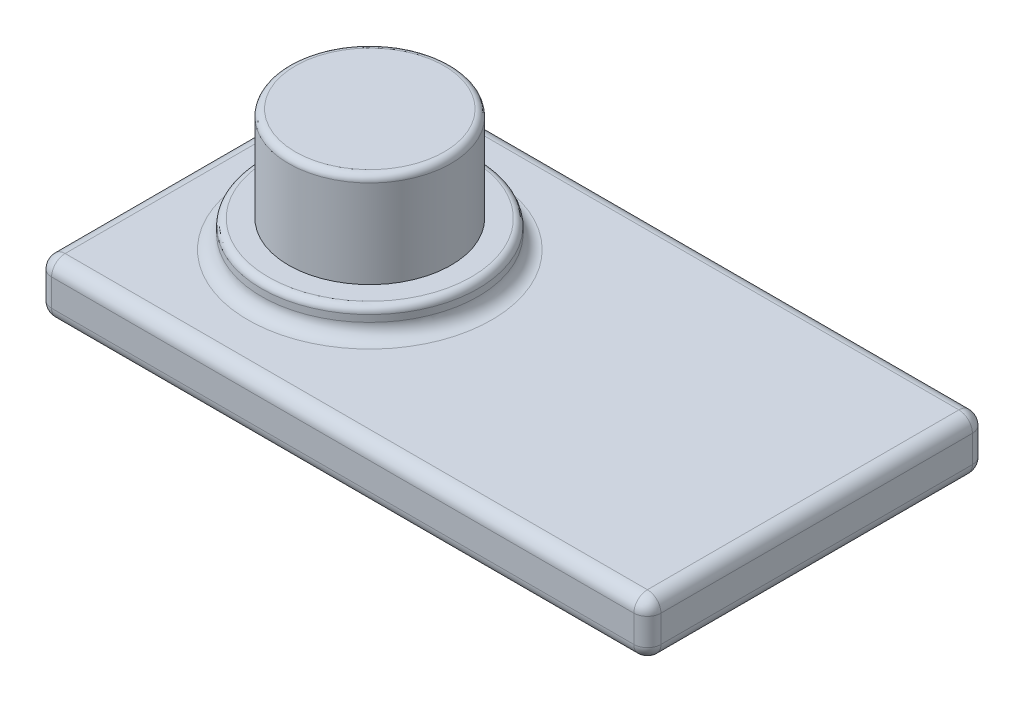
ISO-10303-21;
HEADER;
FILE_DESCRIPTION(('STEP AP214'),'2;1');
FILE_NAME('part.step','',(''),(''),'','','');
FILE_SCHEMA(('AUTOMOTIVE_DESIGN { 1 0 10303 214 1 1 1 1 }'));
ENDSEC;
DATA;
#1=APPLICATION_CONTEXT('core data for automotive mechanical design processes');
#2=APPLICATION_PROTOCOL_DEFINITION('international standard','automotive_design',2000,#1);
#3=PRODUCT_CONTEXT('',#1,'mechanical');
#4=PRODUCT('Part','Part','',(#3));
#5=PRODUCT_RELATED_PRODUCT_CATEGORY('part','',(#4));
#6=PRODUCT_DEFINITION_FORMATION('','',#4);
#7=PRODUCT_DEFINITION_CONTEXT('part definition',#1,'design');
#8=PRODUCT_DEFINITION('design','',#6,#7);
#9=PRODUCT_DEFINITION_SHAPE('','',#8);
#10=(LENGTH_UNIT() NAMED_UNIT(*) SI_UNIT(.MILLI.,.METRE.));
#11=(NAMED_UNIT(*) PLANE_ANGLE_UNIT() SI_UNIT($,.RADIAN.));
#12=(NAMED_UNIT(*) SI_UNIT($,.STERADIAN.) SOLID_ANGLE_UNIT());
#13=UNCERTAINTY_MEASURE_WITH_UNIT(LENGTH_MEASURE(1.E-05),#10,'distance_accuracy_value','');
#14=(GEOMETRIC_REPRESENTATION_CONTEXT(3) GLOBAL_UNCERTAINTY_ASSIGNED_CONTEXT((#13)) GLOBAL_UNIT_ASSIGNED_CONTEXT((#10,
#11,#12)) REPRESENTATION_CONTEXT('',''));
#15=CARTESIAN_POINT('',(0.,0.,0.));
#16=DIRECTION('',(0.,0.,1.));
#17=DIRECTION('',(1.,0.,0.));
#18=AXIS2_PLACEMENT_3D('',#15,#16,#17);
#19=CARTESIAN_POINT('',(0.,2.,0.));
#20=DIRECTION('',(1.,0.,0.));
#21=DIRECTION('',(0.,0.,-1.));
#22=AXIS2_PLACEMENT_3D('',#19,#20,#21);
#23=PLANE('',#22);
#24=DIRECTION('',(0.,0.,1.));
#25=VECTOR('',#24,1.);
#26=CARTESIAN_POINT('',(0.,0.5,0.));
#27=LINE('',#26,#25);
#28=CARTESIAN_POINT('',(0.,0.5,-12.));
#29=VERTEX_POINT('',#28);
#30=CARTESIAN_POINT('',(0.,0.5,-0.5));
#31=VERTEX_POINT('',#30);
#32=EDGE_CURVE('E222',#29,#31,#27,.T.);
#33=ORIENTED_EDGE('',*,*,#32,.T.);
#34=DIRECTION('',(0.,-1.,0.));
#35=VECTOR('',#34,1.);
#36=CARTESIAN_POINT('',(0.,2.,-0.5));
#37=LINE('',#36,#35);
#38=CARTESIAN_POINT('',(0.,1.5,-0.5));
#39=VERTEX_POINT('',#38);
#40=EDGE_CURVE('E226',#31,#39,#37,.F.);
#41=ORIENTED_EDGE('',*,*,#40,.T.);
#42=DIRECTION('',(0.,0.,1.));
#43=VECTOR('',#42,1.);
#44=CARTESIAN_POINT('',(0.,1.5,0.));
#45=LINE('',#44,#43);
#46=CARTESIAN_POINT('',(0.,1.5,-12.));
#47=VERTEX_POINT('',#46);
#48=EDGE_CURVE('E219',#39,#47,#45,.F.);
#49=ORIENTED_EDGE('',*,*,#48,.T.);
#50=DIRECTION('',(0.,-1.,0.));
#51=VECTOR('',#50,1.);
#52=CARTESIAN_POINT('',(0.,2.,-12.));
#53=LINE('',#52,#51);
#54=EDGE_CURVE('E216',#47,#29,#53,.T.);
#55=ORIENTED_EDGE('',*,*,#54,.T.);
#56=EDGE_LOOP('',(#33,#41,#49,#55));
#57=FACE_BOUND('',#56,.T.);
#58=ADVANCED_FACE('F39',(#57),#23,.F.);
#59=CARTESIAN_POINT('',(0.,2.,0.));
#60=DIRECTION('',(0.,0.,-1.));
#61=DIRECTION('',(-1.,0.,0.));
#62=AXIS2_PLACEMENT_3D('',#59,#60,#61);
#63=PLANE('',#62);
#64=DIRECTION('',(1.,0.,0.));
#65=VECTOR('',#64,1.);
#66=CARTESIAN_POINT('',(22.5,0.5,0.));
#67=LINE('',#66,#65);
#68=CARTESIAN_POINT('',(0.5,0.5,0.));
#69=VERTEX_POINT('',#68);
#70=CARTESIAN_POINT('',(22.,0.5,0.));
#71=VERTEX_POINT('',#70);
#72=EDGE_CURVE('E140',#69,#71,#67,.T.);
#73=ORIENTED_EDGE('',*,*,#72,.T.);
#74=DIRECTION('',(0.,-1.,0.));
#75=VECTOR('',#74,1.);
#76=CARTESIAN_POINT('',(22.,2.,0.));
#77=LINE('',#76,#75);
#78=CARTESIAN_POINT('',(22.,1.5,0.));
#79=VERTEX_POINT('',#78);
#80=EDGE_CURVE('E135',#71,#79,#77,.F.);
#81=ORIENTED_EDGE('',*,*,#80,.T.);
#82=DIRECTION('',(1.,0.,0.));
#83=VECTOR('',#82,1.);
#84=CARTESIAN_POINT('',(0.,1.5,0.));
#85=LINE('',#84,#83);
#86=CARTESIAN_POINT('',(0.5,1.5,0.));
#87=VERTEX_POINT('',#86);
#88=EDGE_CURVE('E127',#79,#87,#85,.F.);
#89=ORIENTED_EDGE('',*,*,#88,.T.);
#90=DIRECTION('',(0.,-1.,0.));
#91=VECTOR('',#90,1.);
#92=CARTESIAN_POINT('',(0.5,2.,0.));
#93=LINE('',#92,#91);
#94=EDGE_CURVE('E132',#87,#69,#93,.T.);
#95=ORIENTED_EDGE('',*,*,#94,.T.);
#96=EDGE_LOOP('',(#73,#81,#89,#95));
#97=FACE_BOUND('',#96,.T.);
#98=ADVANCED_FACE('F130',(#97),#63,.F.);
#99=CARTESIAN_POINT('',(22.5,2.,0.));
#100=DIRECTION('',(-1.,0.,0.));
#101=DIRECTION('',(0.,0.,1.));
#102=AXIS2_PLACEMENT_3D('',#99,#100,#101);
#103=PLANE('',#102);
#104=DIRECTION('',(0.,0.,-1.));
#105=VECTOR('',#104,1.);
#106=CARTESIAN_POINT('',(22.5,0.5,-12.5));
#107=LINE('',#106,#105);
#108=CARTESIAN_POINT('',(22.5,0.5,-0.5));
#109=VERTEX_POINT('',#108);
#110=CARTESIAN_POINT('',(22.5,0.5,-12.));
#111=VERTEX_POINT('',#110);
#112=EDGE_CURVE('E196',#109,#111,#107,.T.);
#113=ORIENTED_EDGE('',*,*,#112,.T.);
#114=DIRECTION('',(0.,-1.,0.));
#115=VECTOR('',#114,1.);
#116=CARTESIAN_POINT('',(22.5,2.,-12.));
#117=LINE('',#116,#115);
#118=CARTESIAN_POINT('',(22.5,1.5,-12.));
#119=VERTEX_POINT('',#118);
#120=EDGE_CURVE('E200',#111,#119,#117,.F.);
#121=ORIENTED_EDGE('',*,*,#120,.T.);
#122=DIRECTION('',(0.,0.,-1.));
#123=VECTOR('',#122,1.);
#124=CARTESIAN_POINT('',(22.5,1.5,0.));
#125=LINE('',#124,#123);
#126=CARTESIAN_POINT('',(22.5,1.5,-0.5));
#127=VERTEX_POINT('',#126);
#128=EDGE_CURVE('E193',#119,#127,#125,.F.);
#129=ORIENTED_EDGE('',*,*,#128,.T.);
#130=DIRECTION('',(0.,-1.,0.));
#131=VECTOR('',#130,1.);
#132=CARTESIAN_POINT('',(22.5,2.,-0.5));
#133=LINE('',#132,#131);
#134=EDGE_CURVE('E190',#127,#109,#133,.T.);
#135=ORIENTED_EDGE('',*,*,#134,.T.);
#136=EDGE_LOOP('',(#113,#121,#129,#135));
#137=FACE_BOUND('',#136,.T.);
#138=ADVANCED_FACE('F350',(#137),#103,.F.);
#139=CARTESIAN_POINT('',(0.,2.,-12.5));
#140=DIRECTION('',(0.,0.,1.));
#141=DIRECTION('',(1.,0.,0.));
#142=AXIS2_PLACEMENT_3D('',#139,#140,#141);
#143=PLANE('',#142);
#144=DIRECTION('',(-1.,0.,0.));
#145=VECTOR('',#144,1.);
#146=CARTESIAN_POINT('',(0.,1.5,-12.5));
#147=LINE('',#146,#145);
#148=CARTESIAN_POINT('',(0.499999999999997,1.5,-12.5));
#149=VERTEX_POINT('',#148);
#150=CARTESIAN_POINT('',(22.,1.5,-12.5));
#151=VERTEX_POINT('',#150);
#152=EDGE_CURVE('E206',#149,#151,#147,.F.);
#153=ORIENTED_EDGE('',*,*,#152,.T.);
#154=DIRECTION('',(0.,-1.,0.));
#155=VECTOR('',#154,1.);
#156=CARTESIAN_POINT('',(22.,2.,-12.5));
#157=LINE('',#156,#155);
#158=CARTESIAN_POINT('',(22.,0.5,-12.5));
#159=VERTEX_POINT('',#158);
#160=EDGE_CURVE('E213',#151,#159,#157,.T.);
#161=ORIENTED_EDGE('',*,*,#160,.T.);
#162=DIRECTION('',(-1.,0.,0.));
#163=VECTOR('',#162,1.);
#164=CARTESIAN_POINT('',(0.,0.5,-12.5));
#165=LINE('',#164,#163);
#166=CARTESIAN_POINT('',(0.499999999999997,0.5,-12.5));
#167=VERTEX_POINT('',#166);
#168=EDGE_CURVE('E209',#159,#167,#165,.T.);
#169=ORIENTED_EDGE('',*,*,#168,.T.);
#170=DIRECTION('',(0.,-1.,0.));
#171=VECTOR('',#170,1.);
#172=CARTESIAN_POINT('',(0.499999999999997,2.,-12.5));
#173=LINE('',#172,#171);
#174=EDGE_CURVE('E203',#167,#149,#173,.F.);
#175=ORIENTED_EDGE('',*,*,#174,.T.);
#176=EDGE_LOOP('',(#153,#161,#169,#175));
#177=FACE_BOUND('',#176,.T.);
#178=ADVANCED_FACE('F455',(#177),#143,.F.);
#179=CARTESIAN_POINT('',(0.,2.,0.));
#180=DIRECTION('',(0.,-1.,0.));
#181=DIRECTION('',(0.,0.,-1.));
#182=AXIS2_PLACEMENT_3D('',#179,#180,#181);
#183=PLANE('',#182);
#184=DIRECTION('',(0.,0.,-1.));
#185=VECTOR('',#184,1.);
#186=CARTESIAN_POINT('',(22.,2.,0.));
#187=LINE('',#186,#185);
#188=CARTESIAN_POINT('',(22.,2.,-0.5));
#189=VERTEX_POINT('',#188);
#190=CARTESIAN_POINT('',(22.,2.,-12.));
#191=VERTEX_POINT('',#190);
#192=EDGE_CURVE('E55',#189,#191,#187,.T.);
#193=ORIENTED_EDGE('',*,*,#192,.T.);
#194=DIRECTION('',(-1.,0.,0.));
#195=VECTOR('',#194,1.);
#196=CARTESIAN_POINT('',(0.,2.,-12.));
#197=LINE('',#196,#195);
#198=CARTESIAN_POINT('',(0.499999999999997,2.,-12.));
#199=VERTEX_POINT('',#198);
#200=EDGE_CURVE('E240',#191,#199,#197,.T.);
#201=ORIENTED_EDGE('',*,*,#200,.T.);
#202=DIRECTION('',(0.,0.,1.));
#203=VECTOR('',#202,1.);
#204=CARTESIAN_POINT('',(0.5,2.,0.));
#205=LINE('',#204,#203);
#206=CARTESIAN_POINT('',(0.5,2.,-0.5));
#207=VERTEX_POINT('',#206);
#208=EDGE_CURVE('E233',#199,#207,#205,.T.);
#209=ORIENTED_EDGE('',*,*,#208,.T.);
#210=DIRECTION('',(1.,0.,0.));
#211=VECTOR('',#210,1.);
#212=CARTESIAN_POINT('',(0.,2.,-0.5));
#213=LINE('',#212,#211);
#214=EDGE_CURVE('E60',#207,#189,#213,.T.);
#215=ORIENTED_EDGE('',*,*,#214,.T.);
#216=EDGE_LOOP('',(#193,#201,#209,#215));
#217=FACE_BOUND('',#216,.T.);
#218=CARTESIAN_POINT('',(6.,2.,-6.25));
#219=DIRECTION('',(0.,-1.,0.));
#220=DIRECTION('',(0.,0.,-1.));
#221=AXIS2_PLACEMENT_3D('',#218,#219,#220);
#222=CIRCLE('',#221,4.5);
#223=CARTESIAN_POINT('',(6.,2.,-10.75));
#224=VERTEX_POINT('',#223);
#225=EDGE_CURVE('E229',#224,#224,#222,.T.);
#226=ORIENTED_EDGE('',*,*,#225,.T.);
#227=EDGE_LOOP('',(#226));
#228=FACE_BOUND('',#227,.T.);
#229=ADVANCED_FACE('F449',(#217,#228),#183,.F.);
#230=CARTESIAN_POINT('',(0.,0.,0.));
#231=DIRECTION('',(0.,-1.,0.));
#232=DIRECTION('',(0.,0.,-1.));
#233=AXIS2_PLACEMENT_3D('',#230,#231,#232);
#234=PLANE('',#233);
#235=DIRECTION('',(0.,0.,-1.));
#236=VECTOR('',#235,1.);
#237=CARTESIAN_POINT('',(22.,0.,0.));
#238=LINE('',#237,#236);
#239=CARTESIAN_POINT('',(22.,0.,-12.));
#240=VERTEX_POINT('',#239);
#241=CARTESIAN_POINT('',(22.,0.,-0.5));
#242=VERTEX_POINT('',#241);
#243=EDGE_CURVE('E183',#240,#242,#238,.F.);
#244=ORIENTED_EDGE('',*,*,#243,.T.);
#245=DIRECTION('',(1.,0.,0.));
#246=VECTOR('',#245,1.);
#247=CARTESIAN_POINT('',(0.,0.,-0.5));
#248=LINE('',#247,#246);
#249=CARTESIAN_POINT('',(0.5,0.,-0.5));
#250=VERTEX_POINT('',#249);
#251=EDGE_CURVE('E186',#242,#250,#248,.F.);
#252=ORIENTED_EDGE('',*,*,#251,.T.);
#253=DIRECTION('',(0.,0.,1.));
#254=VECTOR('',#253,1.);
#255=CARTESIAN_POINT('',(0.499999999999997,0.,-12.5));
#256=LINE('',#255,#254);
#257=CARTESIAN_POINT('',(0.499999999999997,0.,-12.));
#258=VERTEX_POINT('',#257);
#259=EDGE_CURVE('E177',#250,#258,#256,.F.);
#260=ORIENTED_EDGE('',*,*,#259,.T.);
#261=DIRECTION('',(-1.,0.,0.));
#262=VECTOR('',#261,1.);
#263=CARTESIAN_POINT('',(22.5,0.,-12.));
#264=LINE('',#263,#262);
#265=EDGE_CURVE('E180',#258,#240,#264,.F.);
#266=ORIENTED_EDGE('',*,*,#265,.T.);
#267=EDGE_LOOP('',(#244,#252,#260,#266));
#268=FACE_BOUND('',#267,.T.);
#269=ADVANCED_FACE('F439',(#268),#234,.T.);
#270=CARTESIAN_POINT('',(6.,3.,-6.25));
#271=DIRECTION('',(0.,-1.,0.));
#272=DIRECTION('',(0.,0.,-1.));
#273=AXIS2_PLACEMENT_3D('',#270,#271,#272);
#274=CYLINDRICAL_SURFACE('',#273,4.);
#275=CARTESIAN_POINT('',(6.,2.75,-6.25));
#276=DIRECTION('',(0.,1.,0.));
#277=DIRECTION('',(0.,0.,1.));
#278=AXIS2_PLACEMENT_3D('',#275,#276,#277);
#279=CIRCLE('',#278,4.);
#280=CARTESIAN_POINT('',(6.,2.75,-2.25));
#281=VERTEX_POINT('',#280);
#282=EDGE_CURVE('E326',#281,#281,#279,.F.);
#283=ORIENTED_EDGE('',*,*,#282,.T.);
#284=EDGE_LOOP('',(#283));
#285=FACE_BOUND('',#284,.T.);
#286=CARTESIAN_POINT('',(6.,2.5,-6.25));
#287=DIRECTION('',(0.,-1.,0.));
#288=DIRECTION('',(0.,0.,-1.));
#289=AXIS2_PLACEMENT_3D('',#286,#287,#288);
#290=CIRCLE('',#289,4.);
#291=CARTESIAN_POINT('',(6.,2.5,-10.25));
#292=VERTEX_POINT('',#291);
#293=EDGE_CURVE('E243',#292,#292,#290,.F.);
#294=ORIENTED_EDGE('',*,*,#293,.T.);
#295=EDGE_LOOP('',(#294));
#296=FACE_BOUND('',#295,.T.);
#297=ADVANCED_FACE('F436',(#285,#296),#274,.T.);
#298=CARTESIAN_POINT('',(6.,3.,-6.25));
#299=DIRECTION('',(0.,1.,0.));
#300=DIRECTION('',(0.,0.,1.));
#301=AXIS2_PLACEMENT_3D('',#298,#299,#300);
#302=PLANE('',#301);
#303=CARTESIAN_POINT('',(6.,3.,-6.25));
#304=DIRECTION('',(0.,1.,0.));
#305=DIRECTION('',(0.,0.,1.));
#306=AXIS2_PLACEMENT_3D('',#303,#304,#305);
#307=CIRCLE('',#306,3.75);
#308=CARTESIAN_POINT('',(6.,3.,-2.5));
#309=VERTEX_POINT('',#308);
#310=EDGE_CURVE('E247',#309,#309,#307,.T.);
#311=ORIENTED_EDGE('',*,*,#310,.T.);
#312=EDGE_LOOP('',(#311));
#313=FACE_BOUND('',#312,.T.);
#314=CARTESIAN_POINT('',(6.,3.,-6.25));
#315=DIRECTION('',(0.,1.,0.));
#316=DIRECTION('',(0.,0.,1.));
#317=AXIS2_PLACEMENT_3D('',#314,#315,#316);
#318=CIRCLE('',#317,3.);
#319=CARTESIAN_POINT('',(6.,3.,-3.25));
#320=VERTEX_POINT('',#319);
#321=EDGE_CURVE('E166',#320,#320,#318,.T.);
#322=ORIENTED_EDGE('',*,*,#321,.F.);
#323=EDGE_LOOP('',(#322));
#324=FACE_BOUND('',#323,.T.);
#325=ADVANCED_FACE('F438',(#313,#324),#302,.T.);
#326=CARTESIAN_POINT('',(6.,6.5,-6.25));
#327=DIRECTION('',(0.,-1.,0.));
#328=DIRECTION('',(0.,0.,-1.));
#329=AXIS2_PLACEMENT_3D('',#326,#327,#328);
#330=CYLINDRICAL_SURFACE('',#329,3.);
#331=CARTESIAN_POINT('',(6.,6.25,-6.25));
#332=DIRECTION('',(0.,1.,0.));
#333=DIRECTION('',(0.,0.,1.));
#334=AXIS2_PLACEMENT_3D('',#331,#332,#333);
#335=CIRCLE('',#334,3.);
#336=CARTESIAN_POINT('',(6.,6.25,-3.25));
#337=VERTEX_POINT('',#336);
#338=EDGE_CURVE('E11',#337,#337,#335,.F.);
#339=ORIENTED_EDGE('',*,*,#338,.T.);
#340=EDGE_LOOP('',(#339));
#341=FACE_BOUND('',#340,.T.);
#342=ORIENTED_EDGE('',*,*,#321,.T.);
#343=EDGE_LOOP('',(#342));
#344=FACE_BOUND('',#343,.T.);
#345=ADVANCED_FACE('F446',(#341,#344),#330,.T.);
#346=CARTESIAN_POINT('',(6.,6.5,-6.25));
#347=DIRECTION('',(0.,1.,0.));
#348=DIRECTION('',(0.,0.,1.));
#349=AXIS2_PLACEMENT_3D('',#346,#347,#348);
#350=PLANE('',#349);
#351=CARTESIAN_POINT('',(6.,6.5,-6.25));
#352=DIRECTION('',(0.,1.,0.));
#353=DIRECTION('',(0.,0.,1.));
#354=AXIS2_PLACEMENT_3D('',#351,#352,#353);
#355=CIRCLE('',#354,2.75);
#356=CARTESIAN_POINT('',(6.,6.5,-3.5));
#357=VERTEX_POINT('',#356);
#358=EDGE_CURVE('E48',#357,#357,#355,.T.);
#359=ORIENTED_EDGE('',*,*,#358,.T.);
#360=EDGE_LOOP('',(#359));
#361=FACE_BOUND('',#360,.T.);
#362=ADVANCED_FACE('F333',(#361),#350,.T.);
#363=CARTESIAN_POINT('',(0.,1.5,-12.));
#364=DIRECTION('',(-1.,0.,0.));
#365=DIRECTION('',(0.,0.,1.));
#366=AXIS2_PLACEMENT_3D('',#363,#364,#365);
#367=CYLINDRICAL_SURFACE('',#366,0.5);
#368=CARTESIAN_POINT('',(0.499999999999997,1.5,-12.));
#369=DIRECTION('',(-1.,0.,0.));
#370=DIRECTION('',(0.,0.,1.));
#371=AXIS2_PLACEMENT_3D('',#368,#369,#370);
#372=CIRCLE('',#371,0.5);
#373=EDGE_CURVE('E170',#199,#149,#372,.T.);
#374=ORIENTED_EDGE('',*,*,#373,.F.);
#375=ORIENTED_EDGE('',*,*,#200,.F.);
#376=CARTESIAN_POINT('',(22.,1.5,-12.));
#377=DIRECTION('',(1.,0.,0.));
#378=DIRECTION('',(0.,0.,-1.));
#379=AXIS2_PLACEMENT_3D('',#376,#377,#378);
#380=CIRCLE('',#379,0.5);
#381=EDGE_CURVE('E316',#151,#191,#380,.T.);
#382=ORIENTED_EDGE('',*,*,#381,.F.);
#383=ORIENTED_EDGE('',*,*,#152,.F.);
#384=EDGE_LOOP('',(#374,#375,#382,#383));
#385=FACE_BOUND('',#384,.T.);
#386=ADVANCED_FACE('F423',(#385),#367,.T.);
#387=CARTESIAN_POINT('',(0.499999999999997,1.5,-12.));
#388=DIRECTION('',(0.,0.,-1.));
#389=DIRECTION('',(-1.,0.,0.));
#390=AXIS2_PLACEMENT_3D('',#387,#388,#389);
#391=SPHERICAL_SURFACE('',#390,0.5);
#392=CARTESIAN_POINT('',(0.499999999999997,1.5,-12.));
#393=DIRECTION('',(0.,0.,-1.));
#394=DIRECTION('',(-1.,0.,0.));
#395=AXIS2_PLACEMENT_3D('',#392,#393,#394);
#396=CIRCLE('',#395,0.5);
#397=EDGE_CURVE('E308',#199,#47,#396,.F.);
#398=ORIENTED_EDGE('',*,*,#397,.F.);
#399=ORIENTED_EDGE('',*,*,#373,.T.);
#400=CARTESIAN_POINT('',(0.499999999999997,1.5,-12.));
#401=DIRECTION('',(0.,1.,0.));
#402=DIRECTION('',(0.,0.,1.));
#403=AXIS2_PLACEMENT_3D('',#400,#401,#402);
#404=CIRCLE('',#403,0.5);
#405=EDGE_CURVE('E312',#47,#149,#404,.F.);
#406=ORIENTED_EDGE('',*,*,#405,.F.);
#407=EDGE_LOOP('',(#398,#399,#406));
#408=FACE_BOUND('',#407,.T.);
#409=ADVANCED_FACE('F419',(#408),#391,.T.);
#410=CARTESIAN_POINT('',(22.,1.5,-12.));
#411=DIRECTION('',(0.,1.,0.));
#412=DIRECTION('',(0.,0.,1.));
#413=AXIS2_PLACEMENT_3D('',#410,#411,#412);
#414=SPHERICAL_SURFACE('',#413,0.5);
#415=CARTESIAN_POINT('',(22.,1.5,-12.));
#416=DIRECTION('',(0.,1.,0.));
#417=DIRECTION('',(0.,0.,1.));
#418=AXIS2_PLACEMENT_3D('',#415,#416,#417);
#419=CIRCLE('',#418,0.5);
#420=EDGE_CURVE('E300',#151,#119,#419,.F.);
#421=ORIENTED_EDGE('',*,*,#420,.F.);
#422=ORIENTED_EDGE('',*,*,#381,.T.);
#423=CARTESIAN_POINT('',(22.,1.5,-12.));
#424=DIRECTION('',(0.,0.,-1.));
#425=DIRECTION('',(-1.,0.,0.));
#426=AXIS2_PLACEMENT_3D('',#423,#424,#425);
#427=CIRCLE('',#426,0.5);
#428=EDGE_CURVE('E304',#119,#191,#427,.F.);
#429=ORIENTED_EDGE('',*,*,#428,.F.);
#430=EDGE_LOOP('',(#421,#422,#429));
#431=FACE_BOUND('',#430,.T.);
#432=ADVANCED_FACE('F415',(#431),#414,.T.);
#433=CARTESIAN_POINT('',(0.499999999999997,2.,-12.));
#434=DIRECTION('',(0.,-1.,0.));
#435=DIRECTION('',(0.,0.,-1.));
#436=AXIS2_PLACEMENT_3D('',#433,#434,#435);
#437=CYLINDRICAL_SURFACE('',#436,0.5);
#438=ORIENTED_EDGE('',*,*,#405,.T.);
#439=ORIENTED_EDGE('',*,*,#174,.F.);
#440=CARTESIAN_POINT('',(0.499999999999997,0.5,-12.));
#441=DIRECTION('',(0.,-1.,0.));
#442=DIRECTION('',(0.,0.,-1.));
#443=AXIS2_PLACEMENT_3D('',#440,#441,#442);
#444=CIRCLE('',#443,0.5);
#445=EDGE_CURVE('E293',#29,#167,#444,.T.);
#446=ORIENTED_EDGE('',*,*,#445,.F.);
#447=ORIENTED_EDGE('',*,*,#54,.F.);
#448=EDGE_LOOP('',(#438,#439,#446,#447));
#449=FACE_BOUND('',#448,.T.);
#450=ADVANCED_FACE('F411',(#449),#437,.T.);
#451=CARTESIAN_POINT('',(0.5,1.5,0.));
#452=DIRECTION('',(0.,0.,1.));
#453=DIRECTION('',(1.,0.,0.));
#454=AXIS2_PLACEMENT_3D('',#451,#452,#453);
#455=CYLINDRICAL_SURFACE('',#454,0.5);
#456=ORIENTED_EDGE('',*,*,#397,.T.);
#457=ORIENTED_EDGE('',*,*,#48,.F.);
#458=CARTESIAN_POINT('',(0.5,1.5,-0.5));
#459=DIRECTION('',(0.,0.,1.));
#460=DIRECTION('',(1.,0.,0.));
#461=AXIS2_PLACEMENT_3D('',#458,#459,#460);
#462=CIRCLE('',#461,0.5);
#463=EDGE_CURVE('E150',#207,#39,#462,.T.);
#464=ORIENTED_EDGE('',*,*,#463,.F.);
#465=ORIENTED_EDGE('',*,*,#208,.F.);
#466=EDGE_LOOP('',(#456,#457,#464,#465));
#467=FACE_BOUND('',#466,.T.);
#468=ADVANCED_FACE('F408',(#467),#455,.T.);
#469=CARTESIAN_POINT('',(0.,1.5,-0.5));
#470=DIRECTION('',(1.,0.,0.));
#471=DIRECTION('',(0.,0.,-1.));
#472=AXIS2_PLACEMENT_3D('',#469,#470,#471);
#473=CYLINDRICAL_SURFACE('',#472,0.5);
#474=CARTESIAN_POINT('',(22.,1.5,-0.5));
#475=DIRECTION('',(1.,0.,0.));
#476=DIRECTION('',(0.,0.,-1.));
#477=AXIS2_PLACEMENT_3D('',#474,#475,#476);
#478=CIRCLE('',#477,0.5);
#479=EDGE_CURVE('E151',#189,#79,#478,.T.);
#480=ORIENTED_EDGE('',*,*,#479,.F.);
#481=ORIENTED_EDGE('',*,*,#214,.F.);
#482=CARTESIAN_POINT('',(0.5,1.5,-0.5));
#483=DIRECTION('',(-1.,0.,0.));
#484=DIRECTION('',(0.,0.,1.));
#485=AXIS2_PLACEMENT_3D('',#482,#483,#484);
#486=CIRCLE('',#485,0.5);
#487=EDGE_CURVE('E143',#87,#207,#486,.T.);
#488=ORIENTED_EDGE('',*,*,#487,.F.);
#489=ORIENTED_EDGE('',*,*,#88,.F.);
#490=EDGE_LOOP('',(#480,#481,#488,#489));
#491=FACE_BOUND('',#490,.T.);
#492=ADVANCED_FACE('F145',(#491),#473,.T.);
#493=CARTESIAN_POINT('',(22.,1.5,0.));
#494=DIRECTION('',(0.,0.,-1.));
#495=DIRECTION('',(-1.,0.,0.));
#496=AXIS2_PLACEMENT_3D('',#493,#494,#495);
#497=CYLINDRICAL_SURFACE('',#496,0.5);
#498=ORIENTED_EDGE('',*,*,#428,.T.);
#499=ORIENTED_EDGE('',*,*,#192,.F.);
#500=CARTESIAN_POINT('',(22.,1.5,-0.5));
#501=DIRECTION('',(0.,0.,1.));
#502=DIRECTION('',(1.,0.,0.));
#503=AXIS2_PLACEMENT_3D('',#500,#501,#502);
#504=CIRCLE('',#503,0.5);
#505=EDGE_CURVE('E285',#127,#189,#504,.T.);
#506=ORIENTED_EDGE('',*,*,#505,.F.);
#507=ORIENTED_EDGE('',*,*,#128,.F.);
#508=EDGE_LOOP('',(#498,#499,#506,#507));
#509=FACE_BOUND('',#508,.T.);
#510=ADVANCED_FACE('F401',(#509),#497,.T.);
#511=CARTESIAN_POINT('',(22.,2.,-12.));
#512=DIRECTION('',(0.,-1.,0.));
#513=DIRECTION('',(0.,0.,-1.));
#514=AXIS2_PLACEMENT_3D('',#511,#512,#513);
#515=CYLINDRICAL_SURFACE('',#514,0.5);
#516=ORIENTED_EDGE('',*,*,#420,.T.);
#517=ORIENTED_EDGE('',*,*,#120,.F.);
#518=CARTESIAN_POINT('',(22.,0.5,-12.));
#519=DIRECTION('',(0.,-1.,0.));
#520=DIRECTION('',(0.,0.,-1.));
#521=AXIS2_PLACEMENT_3D('',#518,#519,#520);
#522=CIRCLE('',#521,0.5);
#523=EDGE_CURVE('E281',#159,#111,#522,.T.);
#524=ORIENTED_EDGE('',*,*,#523,.F.);
#525=ORIENTED_EDGE('',*,*,#160,.F.);
#526=EDGE_LOOP('',(#516,#517,#524,#525));
#527=FACE_BOUND('',#526,.T.);
#528=ADVANCED_FACE('F397',(#527),#515,.T.);
#529=CARTESIAN_POINT('',(0.,0.5,-12.));
#530=DIRECTION('',(1.,0.,0.));
#531=DIRECTION('',(0.,0.,-1.));
#532=AXIS2_PLACEMENT_3D('',#529,#530,#531);
#533=CYLINDRICAL_SURFACE('',#532,0.5);
#534=CARTESIAN_POINT('',(0.499999999999997,0.5,-12.));
#535=DIRECTION('',(-1.,0.,0.));
#536=DIRECTION('',(0.,0.,1.));
#537=AXIS2_PLACEMENT_3D('',#534,#535,#536);
#538=CIRCLE('',#537,0.5);
#539=EDGE_CURVE('E296',#167,#258,#538,.T.);
#540=ORIENTED_EDGE('',*,*,#539,.F.);
#541=ORIENTED_EDGE('',*,*,#168,.F.);
#542=CARTESIAN_POINT('',(22.,0.5,-12.));
#543=DIRECTION('',(1.,0.,0.));
#544=DIRECTION('',(0.,0.,-1.));
#545=AXIS2_PLACEMENT_3D('',#542,#543,#544);
#546=CIRCLE('',#545,0.5);
#547=EDGE_CURVE('E277',#240,#159,#546,.T.);
#548=ORIENTED_EDGE('',*,*,#547,.F.);
#549=ORIENTED_EDGE('',*,*,#265,.F.);
#550=EDGE_LOOP('',(#540,#541,#548,#549));
#551=FACE_BOUND('',#550,.T.);
#552=ADVANCED_FACE('F393',(#551),#533,.T.);
#553=CARTESIAN_POINT('',(0.499999999999997,0.5,-12.));
#554=DIRECTION('',(0.,0.,-1.));
#555=DIRECTION('',(-1.,0.,0.));
#556=AXIS2_PLACEMENT_3D('',#553,#554,#555);
#557=SPHERICAL_SURFACE('',#556,0.5);
#558=ORIENTED_EDGE('',*,*,#445,.T.);
#559=ORIENTED_EDGE('',*,*,#539,.T.);
#560=CARTESIAN_POINT('',(0.499999999999997,0.5,-12.));
#561=DIRECTION('',(0.,0.,-1.));
#562=DIRECTION('',(-1.,0.,0.));
#563=AXIS2_PLACEMENT_3D('',#560,#561,#562);
#564=CIRCLE('',#563,0.5);
#565=EDGE_CURVE('E159',#29,#258,#564,.F.);
#566=ORIENTED_EDGE('',*,*,#565,.F.);
#567=EDGE_LOOP('',(#558,#559,#566));
#568=FACE_BOUND('',#567,.T.);
#569=ADVANCED_FACE('F390',(#568),#557,.T.);
#570=CARTESIAN_POINT('',(0.5,1.5,-0.5));
#571=DIRECTION('',(0.,1.,0.));
#572=DIRECTION('',(0.,0.,1.));
#573=AXIS2_PLACEMENT_3D('',#570,#571,#572);
#574=SPHERICAL_SURFACE('',#573,0.5);
#575=ORIENTED_EDGE('',*,*,#487,.T.);
#576=ORIENTED_EDGE('',*,*,#463,.T.);
#577=CARTESIAN_POINT('',(0.5,1.5,-0.5));
#578=DIRECTION('',(0.,1.,0.));
#579=DIRECTION('',(0.,0.,1.));
#580=AXIS2_PLACEMENT_3D('',#577,#578,#579);
#581=CIRCLE('',#580,0.5);
#582=EDGE_CURVE('E154',#87,#39,#581,.F.);
#583=ORIENTED_EDGE('',*,*,#582,.F.);
#584=EDGE_LOOP('',(#575,#576,#583));
#585=FACE_BOUND('',#584,.T.);
#586=ADVANCED_FACE('F155',(#585),#574,.T.);
#587=CARTESIAN_POINT('',(22.,1.5,-0.5));
#588=DIRECTION('',(0.,1.,0.));
#589=DIRECTION('',(0.,0.,1.));
#590=AXIS2_PLACEMENT_3D('',#587,#588,#589);
#591=SPHERICAL_SURFACE('',#590,0.5);
#592=ORIENTED_EDGE('',*,*,#505,.T.);
#593=ORIENTED_EDGE('',*,*,#479,.T.);
#594=CARTESIAN_POINT('',(22.,1.5,-0.5));
#595=DIRECTION('',(0.,1.,0.));
#596=DIRECTION('',(0.,0.,1.));
#597=AXIS2_PLACEMENT_3D('',#594,#595,#596);
#598=CIRCLE('',#597,0.5);
#599=EDGE_CURVE('E160',#127,#79,#598,.F.);
#600=ORIENTED_EDGE('',*,*,#599,.F.);
#601=EDGE_LOOP('',(#592,#593,#600));
#602=FACE_BOUND('',#601,.T.);
#603=ADVANCED_FACE('F383',(#602),#591,.T.);
#604=CARTESIAN_POINT('',(22.,0.5,-12.));
#605=DIRECTION('',(0.,0.,-1.));
#606=DIRECTION('',(-1.,0.,0.));
#607=AXIS2_PLACEMENT_3D('',#604,#605,#606);
#608=SPHERICAL_SURFACE('',#607,0.5);
#609=ORIENTED_EDGE('',*,*,#547,.T.);
#610=ORIENTED_EDGE('',*,*,#523,.T.);
#611=CARTESIAN_POINT('',(22.,0.5,-12.));
#612=DIRECTION('',(0.,0.,-1.));
#613=DIRECTION('',(-1.,0.,0.));
#614=AXIS2_PLACEMENT_3D('',#611,#612,#613);
#615=CIRCLE('',#614,0.5);
#616=EDGE_CURVE('E268',#240,#111,#615,.F.);
#617=ORIENTED_EDGE('',*,*,#616,.F.);
#618=EDGE_LOOP('',(#609,#610,#617));
#619=FACE_BOUND('',#618,.T.);
#620=ADVANCED_FACE('F379',(#619),#608,.T.);
#621=CARTESIAN_POINT('',(0.5,0.5,0.));
#622=DIRECTION('',(0.,0.,-1.));
#623=DIRECTION('',(-1.,0.,0.));
#624=AXIS2_PLACEMENT_3D('',#621,#622,#623);
#625=CYLINDRICAL_SURFACE('',#624,0.5);
#626=ORIENTED_EDGE('',*,*,#565,.T.);
#627=ORIENTED_EDGE('',*,*,#259,.F.);
#628=CARTESIAN_POINT('',(0.5,0.5,-0.5));
#629=DIRECTION('',(0.,0.,1.));
#630=DIRECTION('',(1.,0.,0.));
#631=AXIS2_PLACEMENT_3D('',#628,#629,#630);
#632=CIRCLE('',#631,0.5);
#633=EDGE_CURVE('E264',#31,#250,#632,.T.);
#634=ORIENTED_EDGE('',*,*,#633,.F.);
#635=ORIENTED_EDGE('',*,*,#32,.F.);
#636=EDGE_LOOP('',(#626,#627,#634,#635));
#637=FACE_BOUND('',#636,.T.);
#638=ADVANCED_FACE('F376',(#637),#625,.T.);
#639=CARTESIAN_POINT('',(0.5,2.,-0.5));
#640=DIRECTION('',(0.,-1.,0.));
#641=DIRECTION('',(0.,0.,-1.));
#642=AXIS2_PLACEMENT_3D('',#639,#640,#641);
#643=CYLINDRICAL_SURFACE('',#642,0.5);
#644=ORIENTED_EDGE('',*,*,#582,.T.);
#645=ORIENTED_EDGE('',*,*,#40,.F.);
#646=CARTESIAN_POINT('',(0.5,0.5,-0.5));
#647=DIRECTION('',(0.,-1.,0.));
#648=DIRECTION('',(0.,0.,-1.));
#649=AXIS2_PLACEMENT_3D('',#646,#647,#648);
#650=CIRCLE('',#649,0.5);
#651=EDGE_CURVE('E163',#69,#31,#650,.T.);
#652=ORIENTED_EDGE('',*,*,#651,.F.);
#653=ORIENTED_EDGE('',*,*,#94,.F.);
#654=EDGE_LOOP('',(#644,#645,#652,#653));
#655=FACE_BOUND('',#654,.T.);
#656=ADVANCED_FACE('F162',(#655),#643,.T.);
#657=CARTESIAN_POINT('',(22.,2.,-0.5));
#658=DIRECTION('',(0.,-1.,0.));
#659=DIRECTION('',(0.,0.,-1.));
#660=AXIS2_PLACEMENT_3D('',#657,#658,#659);
#661=CYLINDRICAL_SURFACE('',#660,0.5);
#662=ORIENTED_EDGE('',*,*,#599,.T.);
#663=ORIENTED_EDGE('',*,*,#80,.F.);
#664=CARTESIAN_POINT('',(22.,0.5,-0.5));
#665=DIRECTION('',(0.,-1.,0.));
#666=DIRECTION('',(0.,0.,-1.));
#667=AXIS2_PLACEMENT_3D('',#664,#665,#666);
#668=CIRCLE('',#667,0.5);
#669=EDGE_CURVE('E258',#109,#71,#668,.T.);
#670=ORIENTED_EDGE('',*,*,#669,.F.);
#671=ORIENTED_EDGE('',*,*,#134,.F.);
#672=EDGE_LOOP('',(#662,#663,#670,#671));
#673=FACE_BOUND('',#672,.T.);
#674=ADVANCED_FACE('F369',(#673),#661,.T.);
#675=CARTESIAN_POINT('',(22.,0.5,0.));
#676=DIRECTION('',(0.,0.,1.));
#677=DIRECTION('',(1.,0.,0.));
#678=AXIS2_PLACEMENT_3D('',#675,#676,#677);
#679=CYLINDRICAL_SURFACE('',#678,0.5);
#680=ORIENTED_EDGE('',*,*,#616,.T.);
#681=ORIENTED_EDGE('',*,*,#112,.F.);
#682=CARTESIAN_POINT('',(22.,0.5,-0.5));
#683=DIRECTION('',(0.,0.,1.));
#684=DIRECTION('',(1.,0.,0.));
#685=AXIS2_PLACEMENT_3D('',#682,#683,#684);
#686=CIRCLE('',#685,0.5);
#687=EDGE_CURVE('E254',#242,#109,#686,.T.);
#688=ORIENTED_EDGE('',*,*,#687,.F.);
#689=ORIENTED_EDGE('',*,*,#243,.F.);
#690=EDGE_LOOP('',(#680,#681,#688,#689));
#691=FACE_BOUND('',#690,.T.);
#692=ADVANCED_FACE('F365',(#691),#679,.T.);
#693=CARTESIAN_POINT('',(0.5,0.5,-0.5));
#694=DIRECTION('',(-1.,0.,0.));
#695=DIRECTION('',(0.,0.,1.));
#696=AXIS2_PLACEMENT_3D('',#693,#694,#695);
#697=SPHERICAL_SURFACE('',#696,0.5);
#698=ORIENTED_EDGE('',*,*,#651,.T.);
#699=ORIENTED_EDGE('',*,*,#633,.T.);
#700=CARTESIAN_POINT('',(0.5,0.5,-0.5));
#701=DIRECTION('',(-1.,0.,0.));
#702=DIRECTION('',(0.,0.,1.));
#703=AXIS2_PLACEMENT_3D('',#700,#701,#702);
#704=CIRCLE('',#703,0.5);
#705=EDGE_CURVE('E251',#69,#250,#704,.F.);
#706=ORIENTED_EDGE('',*,*,#705,.F.);
#707=EDGE_LOOP('',(#698,#699,#706));
#708=FACE_BOUND('',#707,.T.);
#709=ADVANCED_FACE('F361',(#708),#697,.T.);
#710=CARTESIAN_POINT('',(22.,0.5,-0.5));
#711=DIRECTION('',(1.,0.,0.));
#712=DIRECTION('',(0.,0.,-1.));
#713=AXIS2_PLACEMENT_3D('',#710,#711,#712);
#714=SPHERICAL_SURFACE('',#713,0.5);
#715=ORIENTED_EDGE('',*,*,#687,.T.);
#716=ORIENTED_EDGE('',*,*,#669,.T.);
#717=CARTESIAN_POINT('',(22.,0.5,-0.5));
#718=DIRECTION('',(1.,0.,0.));
#719=DIRECTION('',(0.,0.,-1.));
#720=AXIS2_PLACEMENT_3D('',#717,#718,#719);
#721=CIRCLE('',#720,0.5);
#722=EDGE_CURVE('E248',#242,#71,#721,.F.);
#723=ORIENTED_EDGE('',*,*,#722,.F.);
#724=EDGE_LOOP('',(#715,#716,#723));
#725=FACE_BOUND('',#724,.T.);
#726=ADVANCED_FACE('F357',(#725),#714,.T.);
#727=CARTESIAN_POINT('',(0.,0.5,-0.5));
#728=DIRECTION('',(-1.,0.,0.));
#729=DIRECTION('',(0.,0.,1.));
#730=AXIS2_PLACEMENT_3D('',#727,#728,#729);
#731=CYLINDRICAL_SURFACE('',#730,0.5);
#732=ORIENTED_EDGE('',*,*,#705,.T.);
#733=ORIENTED_EDGE('',*,*,#251,.F.);
#734=ORIENTED_EDGE('',*,*,#722,.T.);
#735=ORIENTED_EDGE('',*,*,#72,.F.);
#736=EDGE_LOOP('',(#732,#733,#734,#735));
#737=FACE_BOUND('',#736,.T.);
#738=ADVANCED_FACE('F354',(#737),#731,.T.);
#739=CARTESIAN_POINT('',(6.,2.5,-6.25));
#740=DIRECTION('',(0.,-1.,0.));
#741=DIRECTION('',(0.,0.,-1.));
#742=AXIS2_PLACEMENT_3D('',#739,#740,#741);
#743=TOROIDAL_SURFACE('',#742,4.5,0.5);
#744=ORIENTED_EDGE('',*,*,#225,.F.);
#745=EDGE_LOOP('',(#744));
#746=FACE_BOUND('',#745,.T.);
#747=ORIENTED_EDGE('',*,*,#293,.F.);
#748=EDGE_LOOP('',(#747));
#749=FACE_BOUND('',#748,.T.);
#750=ADVANCED_FACE('F341',(#746,#749),#743,.F.);
#751=CARTESIAN_POINT('',(6.,2.75,-6.25));
#752=DIRECTION('',(0.,1.,0.));
#753=DIRECTION('',(0.,0.,1.));
#754=AXIS2_PLACEMENT_3D('',#751,#752,#753);
#755=TOROIDAL_SURFACE('',#754,3.75,0.25);
#756=ORIENTED_EDGE('',*,*,#282,.F.);
#757=EDGE_LOOP('',(#756));
#758=FACE_BOUND('',#757,.T.);
#759=ORIENTED_EDGE('',*,*,#310,.F.);
#760=EDGE_LOOP('',(#759));
#761=FACE_BOUND('',#760,.T.);
#762=ADVANCED_FACE('F336',(#758,#761),#755,.T.);
#763=CARTESIAN_POINT('',(6.,6.25,-6.25));
#764=DIRECTION('',(0.,1.,0.));
#765=DIRECTION('',(0.,0.,1.));
#766=AXIS2_PLACEMENT_3D('',#763,#764,#765);
#767=TOROIDAL_SURFACE('',#766,2.75,0.25);
#768=ORIENTED_EDGE('',*,*,#338,.F.);
#769=EDGE_LOOP('',(#768));
#770=FACE_BOUND('',#769,.T.);
#771=ORIENTED_EDGE('',*,*,#358,.F.);
#772=EDGE_LOOP('',(#771));
#773=FACE_BOUND('',#772,.T.);
#774=ADVANCED_FACE('F41',(#770,#773),#767,.T.);
#775=CLOSED_SHELL('',(#58,#98,#138,#178,#229,#269,#297,#325,#345,#362,#386,#409,#432,#450,#468,
#492,#510,#528,#552,#569,#586,#603,#620,#638,#656,#674,#692,#709,#726,#738,#750,#762,#774));
#776=MANIFOLD_SOLID_BREP('B2',#775);
#777=ADVANCED_BREP_SHAPE_REPRESENTATION('',(#18,#776),#14);
#778=SHAPE_DEFINITION_REPRESENTATION(#9,#777);
ENDSEC;
END-ISO-10303-21;
